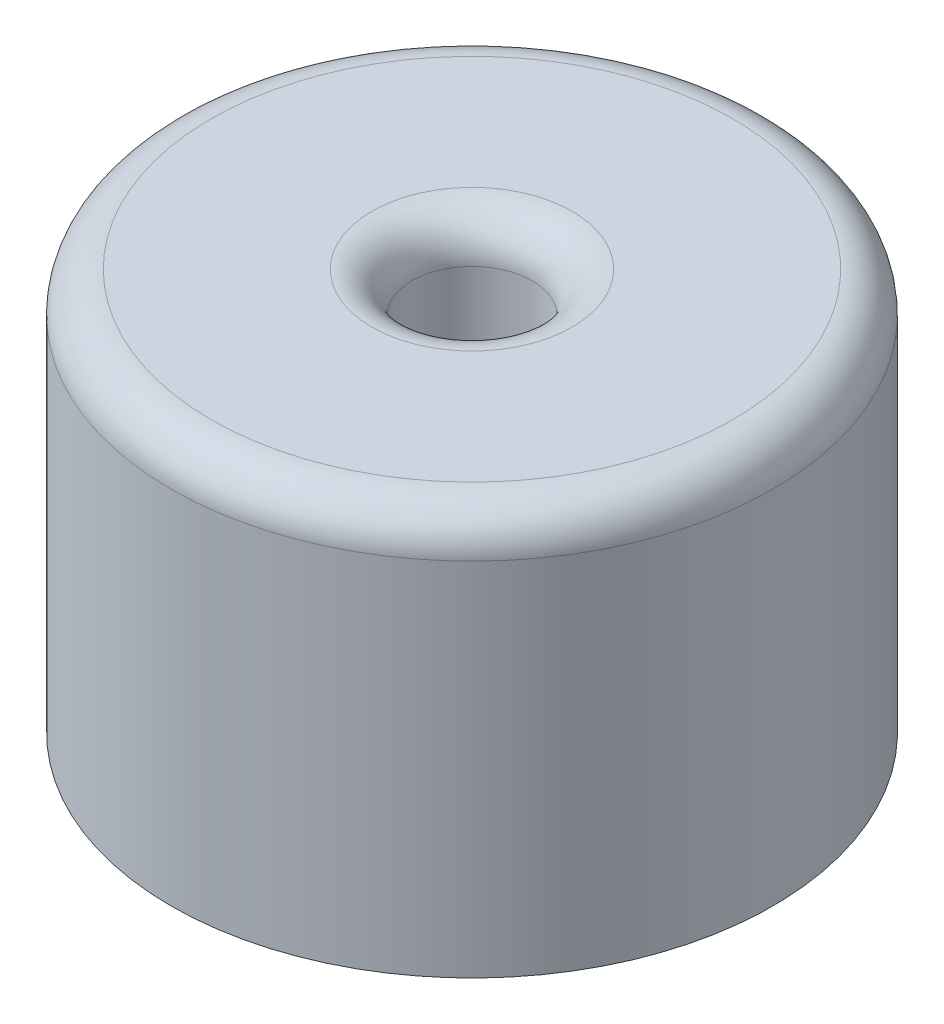
ISO-10303-21;
HEADER;
FILE_DESCRIPTION(('STEP AP214'),'2;1');
FILE_NAME('part.step','',(''),(''),'','','');
FILE_SCHEMA(('AUTOMOTIVE_DESIGN { 1 0 10303 214 1 1 1 1 }'));
ENDSEC;
DATA;
#1=APPLICATION_CONTEXT('core data for automotive mechanical design processes');
#2=APPLICATION_PROTOCOL_DEFINITION('international standard','automotive_design',2000,#1);
#3=PRODUCT_CONTEXT('',#1,'mechanical');
#4=PRODUCT('Part','Part','',(#3));
#5=PRODUCT_RELATED_PRODUCT_CATEGORY('part','',(#4));
#6=PRODUCT_DEFINITION_FORMATION('','',#4);
#7=PRODUCT_DEFINITION_CONTEXT('part definition',#1,'design');
#8=PRODUCT_DEFINITION('design','',#6,#7);
#9=PRODUCT_DEFINITION_SHAPE('','',#8);
#10=(LENGTH_UNIT() NAMED_UNIT(*) SI_UNIT(.MILLI.,.METRE.));
#11=(NAMED_UNIT(*) PLANE_ANGLE_UNIT() SI_UNIT($,.RADIAN.));
#12=(NAMED_UNIT(*) SI_UNIT($,.STERADIAN.) SOLID_ANGLE_UNIT());
#13=UNCERTAINTY_MEASURE_WITH_UNIT(LENGTH_MEASURE(1.E-05),#10,'distance_accuracy_value','');
#14=(GEOMETRIC_REPRESENTATION_CONTEXT(3) GLOBAL_UNCERTAINTY_ASSIGNED_CONTEXT((#13)) GLOBAL_UNIT_ASSIGNED_CONTEXT((#10,
#11,#12)) REPRESENTATION_CONTEXT('',''));
#15=CARTESIAN_POINT('',(0.,0.,0.));
#16=DIRECTION('',(0.,0.,1.));
#17=DIRECTION('',(1.,0.,0.));
#18=AXIS2_PLACEMENT_3D('',#15,#16,#17);
#19=CARTESIAN_POINT('',(0.,25.4,0.));
#20=DIRECTION('',(0.,-1.,0.));
#21=DIRECTION('',(0.,0.,-1.));
#22=AXIS2_PLACEMENT_3D('',#19,#20,#21);
#23=CYLINDRICAL_SURFACE('',#22,19.05);
#24=CARTESIAN_POINT('',(0.,22.86,0.));
#25=DIRECTION('',(0.,1.,0.));
#26=DIRECTION('',(0.,0.,1.));
#27=AXIS2_PLACEMENT_3D('',#24,#25,#26);
#28=CIRCLE('',#27,19.05);
#29=CARTESIAN_POINT('',(0.,22.86,19.05));
#30=VERTEX_POINT('',#29);
#31=EDGE_CURVE('E55',#30,#30,#28,.F.);
#32=ORIENTED_EDGE('',*,*,#31,.T.);
#33=EDGE_LOOP('',(#32));
#34=FACE_BOUND('',#33,.T.);
#35=CARTESIAN_POINT('',(0.,0.,0.));
#36=DIRECTION('',(0.,1.,0.));
#37=DIRECTION('',(0.,0.,1.));
#38=AXIS2_PLACEMENT_3D('',#35,#36,#37);
#39=CIRCLE('',#38,19.05);
#40=CARTESIAN_POINT('',(0.,0.,19.05));
#41=VERTEX_POINT('',#40);
#42=EDGE_CURVE('E69',#41,#41,#39,.T.);
#43=ORIENTED_EDGE('',*,*,#42,.T.);
#44=EDGE_LOOP('',(#43));
#45=FACE_BOUND('',#44,.T.);
#46=ADVANCED_FACE('F37',(#34,#45),#23,.T.);
#47=CARTESIAN_POINT('',(0.,25.4,0.));
#48=DIRECTION('',(0.,1.,0.));
#49=DIRECTION('',(0.,0.,1.));
#50=AXIS2_PLACEMENT_3D('',#47,#48,#49);
#51=PLANE('',#50);
#52=CARTESIAN_POINT('',(0.,25.4,0.));
#53=DIRECTION('',(0.,1.,0.));
#54=DIRECTION('',(0.,0.,1.));
#55=AXIS2_PLACEMENT_3D('',#52,#53,#54);
#56=CIRCLE('',#55,16.51);
#57=CARTESIAN_POINT('',(0.,25.4,16.51));
#58=VERTEX_POINT('',#57);
#59=EDGE_CURVE('E61',#58,#58,#56,.T.);
#60=ORIENTED_EDGE('',*,*,#59,.T.);
#61=EDGE_LOOP('',(#60));
#62=FACE_BOUND('',#61,.T.);
#63=CARTESIAN_POINT('',(0.,25.4,0.));
#64=DIRECTION('',(0.,1.,0.));
#65=DIRECTION('',(0.,0.,1.));
#66=AXIS2_PLACEMENT_3D('',#63,#64,#65);
#67=CIRCLE('',#66,6.35);
#68=CARTESIAN_POINT('',(0.,25.4,6.35));
#69=VERTEX_POINT('',#68);
#70=EDGE_CURVE('E65',#69,#69,#67,.F.);
#71=ORIENTED_EDGE('',*,*,#70,.T.);
#72=EDGE_LOOP('',(#71));
#73=FACE_BOUND('',#72,.T.);
#74=ADVANCED_FACE('F78',(#62,#73),#51,.T.);
#75=CARTESIAN_POINT('',(0.,0.,0.));
#76=DIRECTION('',(0.,1.,0.));
#77=DIRECTION('',(0.,0.,1.));
#78=AXIS2_PLACEMENT_3D('',#75,#76,#77);
#79=PLANE('',#78);
#80=CARTESIAN_POINT('',(0.,0.,0.));
#81=DIRECTION('',(0.,1.,0.));
#82=DIRECTION('',(0.,0.,1.));
#83=AXIS2_PLACEMENT_3D('',#80,#81,#82);
#84=CIRCLE('',#83,6.35);
#85=CARTESIAN_POINT('',(0.,0.,6.35));
#86=VERTEX_POINT('',#85);
#87=EDGE_CURVE('E10',#86,#86,#84,.T.);
#88=ORIENTED_EDGE('',*,*,#87,.T.);
#89=EDGE_LOOP('',(#88));
#90=FACE_BOUND('',#89,.T.);
#91=ORIENTED_EDGE('',*,*,#42,.F.);
#92=EDGE_LOOP('',(#91));
#93=FACE_BOUND('',#92,.T.);
#94=ADVANCED_FACE('F75',(#90,#93),#79,.F.);
#95=CARTESIAN_POINT('',(0.,0.,0.));
#96=DIRECTION('',(0.,1.,0.));
#97=DIRECTION('',(0.,0.,1.));
#98=AXIS2_PLACEMENT_3D('',#95,#96,#97);
#99=CYLINDRICAL_SURFACE('',#98,3.81);
#100=CARTESIAN_POINT('',(0.,22.86,0.));
#101=DIRECTION('',(0.,1.,0.));
#102=DIRECTION('',(0.,0.,1.));
#103=AXIS2_PLACEMENT_3D('',#100,#101,#102);
#104=CIRCLE('',#103,3.81);
#105=CARTESIAN_POINT('',(0.,22.86,3.81));
#106=VERTEX_POINT('',#105);
#107=EDGE_CURVE('E45',#106,#106,#104,.T.);
#108=ORIENTED_EDGE('',*,*,#107,.T.);
#109=EDGE_LOOP('',(#108));
#110=FACE_BOUND('',#109,.T.);
#111=CARTESIAN_POINT('',(0.,2.54,0.));
#112=DIRECTION('',(0.,1.,0.));
#113=DIRECTION('',(0.,0.,1.));
#114=AXIS2_PLACEMENT_3D('',#111,#112,#113);
#115=CIRCLE('',#114,3.81);
#116=CARTESIAN_POINT('',(0.,2.54,3.81));
#117=VERTEX_POINT('',#116);
#118=EDGE_CURVE('E50',#117,#117,#115,.F.);
#119=ORIENTED_EDGE('',*,*,#118,.T.);
#120=EDGE_LOOP('',(#119));
#121=FACE_BOUND('',#120,.T.);
#122=ADVANCED_FACE('F77',(#110,#121),#99,.F.);
#123=CARTESIAN_POINT('',(0.,22.86,0.));
#124=DIRECTION('',(0.,1.,0.));
#125=DIRECTION('',(0.,0.,1.));
#126=AXIS2_PLACEMENT_3D('',#123,#124,#125);
#127=TOROIDAL_SURFACE('',#126,16.51,2.54);
#128=ORIENTED_EDGE('',*,*,#31,.F.);
#129=EDGE_LOOP('',(#128));
#130=FACE_BOUND('',#129,.T.);
#131=ORIENTED_EDGE('',*,*,#59,.F.);
#132=EDGE_LOOP('',(#131));
#133=FACE_BOUND('',#132,.T.);
#134=ADVANCED_FACE('F84',(#130,#133),#127,.T.);
#135=CARTESIAN_POINT('',(0.,22.86,0.));
#136=DIRECTION('',(0.,1.,0.));
#137=DIRECTION('',(0.,0.,1.));
#138=AXIS2_PLACEMENT_3D('',#135,#136,#137);
#139=TOROIDAL_SURFACE('',#138,6.35,2.54);
#140=ORIENTED_EDGE('',*,*,#70,.F.);
#141=EDGE_LOOP('',(#140));
#142=FACE_BOUND('',#141,.T.);
#143=ORIENTED_EDGE('',*,*,#107,.F.);
#144=EDGE_LOOP('',(#143));
#145=FACE_BOUND('',#144,.T.);
#146=ADVANCED_FACE('F95',(#142,#145),#139,.T.);
#147=CARTESIAN_POINT('',(0.,2.54,0.));
#148=DIRECTION('',(0.,1.,0.));
#149=DIRECTION('',(0.,0.,1.));
#150=AXIS2_PLACEMENT_3D('',#147,#148,#149);
#151=TOROIDAL_SURFACE('',#150,6.35,2.54);
#152=ORIENTED_EDGE('',*,*,#118,.F.);
#153=EDGE_LOOP('',(#152));
#154=FACE_BOUND('',#153,.T.);
#155=ORIENTED_EDGE('',*,*,#87,.F.);
#156=EDGE_LOOP('',(#155));
#157=FACE_BOUND('',#156,.T.);
#158=ADVANCED_FACE('F39',(#154,#157),#151,.T.);
#159=CLOSED_SHELL('',(#46,#74,#94,#122,#134,#146,#158));
#160=MANIFOLD_SOLID_BREP('B2',#159);
#161=ADVANCED_BREP_SHAPE_REPRESENTATION('',(#18,#160),#14);
#162=SHAPE_DEFINITION_REPRESENTATION(#9,#161);
ENDSEC;
END-ISO-10303-21;
